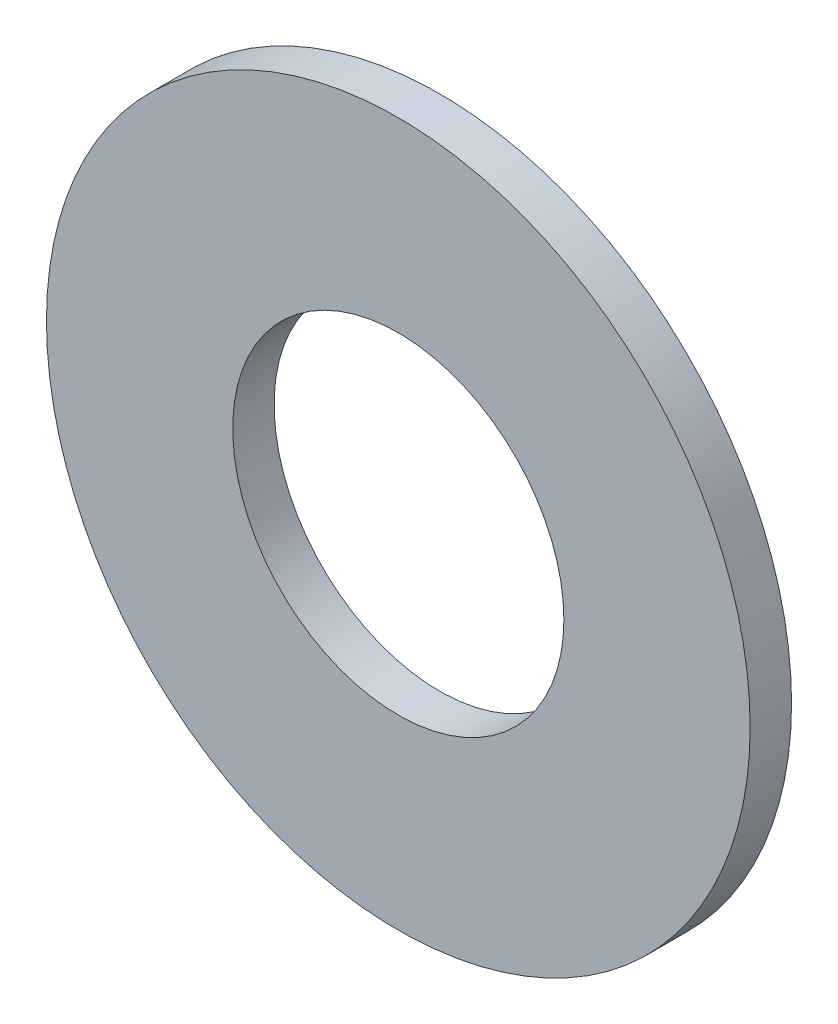
ISO-10303-21;
HEADER;
FILE_DESCRIPTION(('STEP AP214'),'2;1');
FILE_NAME('part.step','',(''),(''),'','','');
FILE_SCHEMA(('AUTOMOTIVE_DESIGN { 1 0 10303 214 1 1 1 1 }'));
ENDSEC;
DATA;
#1=APPLICATION_CONTEXT('core data for automotive mechanical design processes');
#2=APPLICATION_PROTOCOL_DEFINITION('international standard','automotive_design',2000,#1);
#3=PRODUCT_CONTEXT('',#1,'mechanical');
#4=PRODUCT('Part','Part','',(#3));
#5=PRODUCT_RELATED_PRODUCT_CATEGORY('part','',(#4));
#6=PRODUCT_DEFINITION_FORMATION('','',#4);
#7=PRODUCT_DEFINITION_CONTEXT('part definition',#1,'design');
#8=PRODUCT_DEFINITION('design','',#6,#7);
#9=PRODUCT_DEFINITION_SHAPE('','',#8);
#10=(LENGTH_UNIT() NAMED_UNIT(*) SI_UNIT(.MILLI.,.METRE.));
#11=(NAMED_UNIT(*) PLANE_ANGLE_UNIT() SI_UNIT($,.RADIAN.));
#12=(NAMED_UNIT(*) SI_UNIT($,.STERADIAN.) SOLID_ANGLE_UNIT());
#13=UNCERTAINTY_MEASURE_WITH_UNIT(LENGTH_MEASURE(1.E-05),#10,'distance_accuracy_value','');
#14=(GEOMETRIC_REPRESENTATION_CONTEXT(3) GLOBAL_UNCERTAINTY_ASSIGNED_CONTEXT((#13)) GLOBAL_UNIT_ASSIGNED_CONTEXT((#10,
#11,#12)) REPRESENTATION_CONTEXT('',''));
#15=CARTESIAN_POINT('',(0.,0.,0.));
#16=DIRECTION('',(0.,0.,1.));
#17=DIRECTION('',(1.,0.,0.));
#18=AXIS2_PLACEMENT_3D('',#15,#16,#17);
#19=CARTESIAN_POINT('',(0.,0.,1.));
#20=DIRECTION('',(0.,0.,1.));
#21=DIRECTION('',(1.,0.,0.));
#22=AXIS2_PLACEMENT_3D('',#19,#20,#21);
#23=PLANE('',#22);
#24=CARTESIAN_POINT('',(0.,0.,1.));
#25=DIRECTION('',(0.,0.,1.));
#26=DIRECTION('',(1.,0.,0.));
#27=AXIS2_PLACEMENT_3D('',#24,#25,#26);
#28=CIRCLE('',#27,8.5);
#29=CARTESIAN_POINT('',(8.5,0.,1.));
#30=VERTEX_POINT('',#29);
#31=EDGE_CURVE('E10',#30,#30,#28,.T.);
#32=ORIENTED_EDGE('',*,*,#31,.T.);
#33=EDGE_LOOP('',(#32));
#34=FACE_BOUND('',#33,.T.);
#35=CARTESIAN_POINT('',(0.,0.,1.));
#36=DIRECTION('',(0.,0.,1.));
#37=DIRECTION('',(1.,0.,0.));
#38=AXIS2_PLACEMENT_3D('',#35,#36,#37);
#39=CIRCLE('',#38,4.);
#40=CARTESIAN_POINT('',(4.,0.,1.));
#41=VERTEX_POINT('',#40);
#42=EDGE_CURVE('E46',#41,#41,#39,.T.);
#43=ORIENTED_EDGE('',*,*,#42,.F.);
#44=EDGE_LOOP('',(#43));
#45=FACE_BOUND('',#44,.T.);
#46=ADVANCED_FACE('F35',(#34,#45),#23,.T.);
#47=CARTESIAN_POINT('',(0.,0.,0.));
#48=DIRECTION('',(0.,0.,1.));
#49=DIRECTION('',(1.,0.,0.));
#50=AXIS2_PLACEMENT_3D('',#47,#48,#49);
#51=PLANE('',#50);
#52=CARTESIAN_POINT('',(0.,0.,0.));
#53=DIRECTION('',(0.,0.,1.));
#54=DIRECTION('',(1.,0.,0.));
#55=AXIS2_PLACEMENT_3D('',#52,#53,#54);
#56=CIRCLE('',#55,8.5);
#57=CARTESIAN_POINT('',(8.5,0.,0.));
#58=VERTEX_POINT('',#57);
#59=EDGE_CURVE('E39',#58,#58,#56,.T.);
#60=ORIENTED_EDGE('',*,*,#59,.F.);
#61=EDGE_LOOP('',(#60));
#62=FACE_BOUND('',#61,.T.);
#63=CARTESIAN_POINT('',(0.,0.,0.));
#64=DIRECTION('',(0.,0.,1.));
#65=DIRECTION('',(1.,0.,0.));
#66=AXIS2_PLACEMENT_3D('',#63,#64,#65);
#67=CIRCLE('',#66,4.);
#68=CARTESIAN_POINT('',(4.,0.,0.));
#69=VERTEX_POINT('',#68);
#70=EDGE_CURVE('E48',#69,#69,#67,.T.);
#71=ORIENTED_EDGE('',*,*,#70,.T.);
#72=EDGE_LOOP('',(#71));
#73=FACE_BOUND('',#72,.T.);
#74=ADVANCED_FACE('F58',(#62,#73),#51,.F.);
#75=CARTESIAN_POINT('',(0.,0.,1.));
#76=DIRECTION('',(0.,0.,-1.));
#77=DIRECTION('',(-1.,0.,0.));
#78=AXIS2_PLACEMENT_3D('',#75,#76,#77);
#79=CYLINDRICAL_SURFACE('',#78,8.5);
#80=ORIENTED_EDGE('',*,*,#31,.F.);
#81=EDGE_LOOP('',(#80));
#82=FACE_BOUND('',#81,.T.);
#83=ORIENTED_EDGE('',*,*,#59,.T.);
#84=EDGE_LOOP('',(#83));
#85=FACE_BOUND('',#84,.T.);
#86=ADVANCED_FACE('F37',(#82,#85),#79,.T.);
#87=CARTESIAN_POINT('',(0.,0.,1.));
#88=DIRECTION('',(0.,0.,-1.));
#89=DIRECTION('',(-1.,0.,0.));
#90=AXIS2_PLACEMENT_3D('',#87,#88,#89);
#91=CYLINDRICAL_SURFACE('',#90,4.);
#92=ORIENTED_EDGE('',*,*,#42,.T.);
#93=EDGE_LOOP('',(#92));
#94=FACE_BOUND('',#93,.T.);
#95=ORIENTED_EDGE('',*,*,#70,.F.);
#96=EDGE_LOOP('',(#95));
#97=FACE_BOUND('',#96,.T.);
#98=ADVANCED_FACE('F54',(#94,#97),#91,.F.);
#99=CLOSED_SHELL('',(#46,#74,#86,#98));
#100=MANIFOLD_SOLID_BREP('B2',#99);
#101=ADVANCED_BREP_SHAPE_REPRESENTATION('',(#18,#100),#14);
#102=SHAPE_DEFINITION_REPRESENTATION(#9,#101);
ENDSEC;
END-ISO-10303-21;
